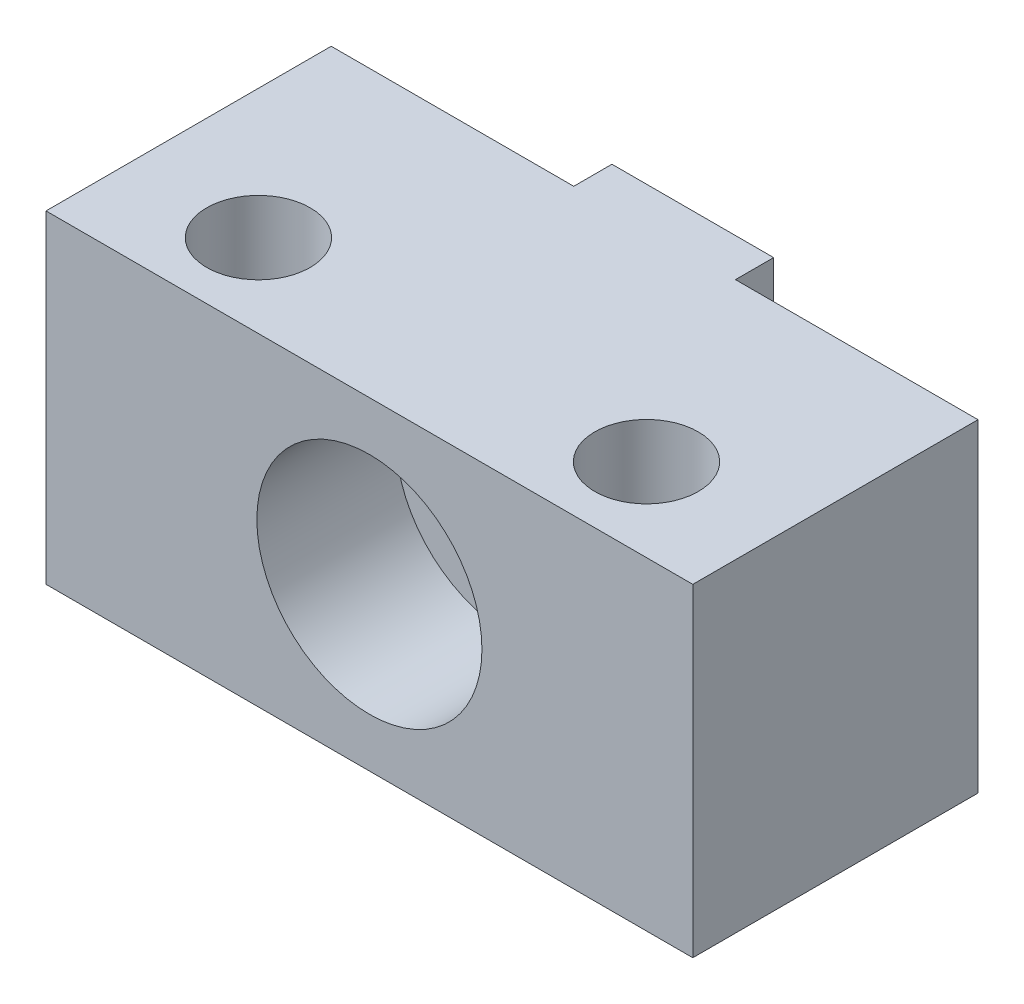
ISO-10303-21;
HEADER;
FILE_DESCRIPTION(('STEP AP214'),'2;1');
FILE_NAME('part.step','',(''),(''),'','','');
FILE_SCHEMA(('AUTOMOTIVE_DESIGN { 1 0 10303 214 1 1 1 1 }'));
ENDSEC;
DATA;
#1=APPLICATION_CONTEXT('core data for automotive mechanical design processes');
#2=APPLICATION_PROTOCOL_DEFINITION('international standard','automotive_design',2000,#1);
#3=PRODUCT_CONTEXT('',#1,'mechanical');
#4=PRODUCT('Part','Part','',(#3));
#5=PRODUCT_RELATED_PRODUCT_CATEGORY('part','',(#4));
#6=PRODUCT_DEFINITION_FORMATION('','',#4);
#7=PRODUCT_DEFINITION_CONTEXT('part definition',#1,'design');
#8=PRODUCT_DEFINITION('design','',#6,#7);
#9=PRODUCT_DEFINITION_SHAPE('','',#8);
#10=(LENGTH_UNIT() NAMED_UNIT(*) SI_UNIT(.MILLI.,.METRE.));
#11=(NAMED_UNIT(*) PLANE_ANGLE_UNIT() SI_UNIT($,.RADIAN.));
#12=(NAMED_UNIT(*) SI_UNIT($,.STERADIAN.) SOLID_ANGLE_UNIT());
#13=UNCERTAINTY_MEASURE_WITH_UNIT(LENGTH_MEASURE(1.E-05),#10,'distance_accuracy_value','');
#14=(GEOMETRIC_REPRESENTATION_CONTEXT(3) GLOBAL_UNCERTAINTY_ASSIGNED_CONTEXT((#13)) GLOBAL_UNIT_ASSIGNED_CONTEXT((#10,
#11,#12)) REPRESENTATION_CONTEXT('',''));
#15=CARTESIAN_POINT('',(0.,0.,0.));
#16=DIRECTION('',(0.,0.,1.));
#17=DIRECTION('',(1.,0.,0.));
#18=AXIS2_PLACEMENT_3D('',#15,#16,#17);
#19=CARTESIAN_POINT('',(-12.7,0.,11.2));
#20=DIRECTION('',(0.,0.,1.));
#21=DIRECTION('',(1.,0.,0.));
#22=AXIS2_PLACEMENT_3D('',#19,#20,#21);
#23=PLANE('',#22);
#24=CARTESIAN_POINT('',(0.,6.35,11.2));
#25=DIRECTION('',(0.,0.,1.));
#26=DIRECTION('',(1.,0.,0.));
#27=AXIS2_PLACEMENT_3D('',#24,#25,#26);
#28=CIRCLE('',#27,4.4196);
#29=CARTESIAN_POINT('',(4.4196,6.35,11.2));
#30=VERTEX_POINT('',#29);
#31=EDGE_CURVE('E184',#30,#30,#28,.T.);
#32=ORIENTED_EDGE('',*,*,#31,.F.);
#33=EDGE_LOOP('',(#32));
#34=FACE_BOUND('',#33,.T.);
#35=DIRECTION('',(1.,0.,0.));
#36=VECTOR('',#35,1.);
#37=CARTESIAN_POINT('',(-12.7,12.7,11.2));
#38=LINE('',#37,#36);
#39=CARTESIAN_POINT('',(-12.7,12.7,11.2));
#40=VERTEX_POINT('',#39);
#41=CARTESIAN_POINT('',(12.7,12.7,11.2));
#42=VERTEX_POINT('',#41);
#43=EDGE_CURVE('E128',#40,#42,#38,.T.);
#44=ORIENTED_EDGE('',*,*,#43,.F.);
#45=DIRECTION('',(0.,1.,0.));
#46=VECTOR('',#45,1.);
#47=CARTESIAN_POINT('',(-12.7,0.,11.2));
#48=LINE('',#47,#46);
#49=CARTESIAN_POINT('',(-12.7,0.,11.2));
#50=VERTEX_POINT('',#49);
#51=EDGE_CURVE('E11',#50,#40,#48,.T.);
#52=ORIENTED_EDGE('',*,*,#51,.F.);
#53=DIRECTION('',(1.,0.,0.));
#54=VECTOR('',#53,1.);
#55=CARTESIAN_POINT('',(-12.7,0.,11.2));
#56=LINE('',#55,#54);
#57=CARTESIAN_POINT('',(12.7,0.,11.2));
#58=VERTEX_POINT('',#57);
#59=EDGE_CURVE('E125',#50,#58,#56,.T.);
#60=ORIENTED_EDGE('',*,*,#59,.T.);
#61=DIRECTION('',(0.,1.,0.));
#62=VECTOR('',#61,1.);
#63=CARTESIAN_POINT('',(12.7,0.,11.2));
#64=LINE('',#63,#62);
#65=EDGE_CURVE('E40',#58,#42,#64,.T.);
#66=ORIENTED_EDGE('',*,*,#65,.T.);
#67=EDGE_LOOP('',(#44,#52,#60,#66));
#68=FACE_BOUND('',#67,.T.);
#69=ADVANCED_FACE('F37',(#34,#68),#23,.T.);
#70=CARTESIAN_POINT('',(-12.7,0.,-1.5));
#71=DIRECTION('',(-1.,0.,0.));
#72=DIRECTION('',(0.,0.,1.));
#73=AXIS2_PLACEMENT_3D('',#70,#71,#72);
#74=PLANE('',#73);
#75=DIRECTION('',(0.,-1.,0.));
#76=VECTOR('',#75,1.);
#77=CARTESIAN_POINT('',(-12.7,12.7,0.));
#78=LINE('',#77,#76);
#79=CARTESIAN_POINT('',(-12.7,12.7,0.));
#80=VERTEX_POINT('',#79);
#81=CARTESIAN_POINT('',(-12.7,0.,0.));
#82=VERTEX_POINT('',#81);
#83=EDGE_CURVE('E153',#80,#82,#78,.T.);
#84=ORIENTED_EDGE('',*,*,#83,.T.);
#85=DIRECTION('',(0.,0.,1.));
#86=VECTOR('',#85,1.);
#87=CARTESIAN_POINT('',(-12.7,0.,-1.5));
#88=LINE('',#87,#86);
#89=EDGE_CURVE('E134',#82,#50,#88,.T.);
#90=ORIENTED_EDGE('',*,*,#89,.T.);
#91=ORIENTED_EDGE('',*,*,#51,.T.);
#92=DIRECTION('',(0.,0.,1.));
#93=VECTOR('',#92,1.);
#94=CARTESIAN_POINT('',(-12.7,12.7,-1.5));
#95=LINE('',#94,#93);
#96=EDGE_CURVE('E122',#80,#40,#95,.T.);
#97=ORIENTED_EDGE('',*,*,#96,.F.);
#98=EDGE_LOOP('',(#84,#90,#91,#97));
#99=FACE_BOUND('',#98,.T.);
#100=ADVANCED_FACE('F192',(#99),#74,.T.);
#101=CARTESIAN_POINT('',(12.7,0.,-1.5));
#102=DIRECTION('',(0.,0.,-1.));
#103=DIRECTION('',(-1.,0.,0.));
#104=AXIS2_PLACEMENT_3D('',#101,#102,#103);
#105=PLANE('',#104);
#106=CARTESIAN_POINT('',(0.,6.35,-1.5));
#107=DIRECTION('',(0.,0.,1.));
#108=DIRECTION('',(1.,0.,0.));
#109=AXIS2_PLACEMENT_3D('',#106,#107,#108);
#110=CIRCLE('',#109,2.50000000000001);
#111=CARTESIAN_POINT('',(2.50000000000001,6.35,-1.5));
#112=VERTEX_POINT('',#111);
#113=EDGE_CURVE('E175',#112,#112,#110,.T.);
#114=ORIENTED_EDGE('',*,*,#113,.T.);
#115=EDGE_LOOP('',(#114));
#116=FACE_BOUND('',#115,.T.);
#117=DIRECTION('',(0.,-1.,0.));
#118=VECTOR('',#117,1.);
#119=CARTESIAN_POINT('',(-3.175,12.7,-1.5));
#120=LINE('',#119,#118);
#121=CARTESIAN_POINT('',(-3.175,12.7,-1.5));
#122=VERTEX_POINT('',#121);
#123=CARTESIAN_POINT('',(-3.175,0.,-1.5));
#124=VERTEX_POINT('',#123);
#125=EDGE_CURVE('E104',#122,#124,#120,.T.);
#126=ORIENTED_EDGE('',*,*,#125,.F.);
#127=DIRECTION('',(-1.,0.,0.));
#128=VECTOR('',#127,1.);
#129=CARTESIAN_POINT('',(12.7,12.7,-1.5));
#130=LINE('',#129,#128);
#131=CARTESIAN_POINT('',(3.175,12.7,-1.5));
#132=VERTEX_POINT('',#131);
#133=EDGE_CURVE('E116',#132,#122,#130,.T.);
#134=ORIENTED_EDGE('',*,*,#133,.F.);
#135=DIRECTION('',(0.,-1.,0.));
#136=VECTOR('',#135,1.);
#137=CARTESIAN_POINT('',(3.175,12.7,-1.5));
#138=LINE('',#137,#136);
#139=CARTESIAN_POINT('',(3.175,0.,-1.5));
#140=VERTEX_POINT('',#139);
#141=EDGE_CURVE('E133',#132,#140,#138,.T.);
#142=ORIENTED_EDGE('',*,*,#141,.T.);
#143=DIRECTION('',(-1.,0.,0.));
#144=VECTOR('',#143,1.);
#145=CARTESIAN_POINT('',(12.7,0.,-1.5));
#146=LINE('',#145,#144);
#147=EDGE_CURVE('E118',#140,#124,#146,.T.);
#148=ORIENTED_EDGE('',*,*,#147,.T.);
#149=EDGE_LOOP('',(#126,#134,#142,#148));
#150=FACE_BOUND('',#149,.T.);
#151=ADVANCED_FACE('F114',(#116,#150),#105,.T.);
#152=CARTESIAN_POINT('',(12.7,0.,11.2));
#153=DIRECTION('',(1.,0.,0.));
#154=DIRECTION('',(0.,0.,-1.));
#155=AXIS2_PLACEMENT_3D('',#152,#153,#154);
#156=PLANE('',#155);
#157=DIRECTION('',(0.,-1.,0.));
#158=VECTOR('',#157,1.);
#159=CARTESIAN_POINT('',(12.7,12.7,0.));
#160=LINE('',#159,#158);
#161=CARTESIAN_POINT('',(12.7,12.7,0.));
#162=VERTEX_POINT('',#161);
#163=CARTESIAN_POINT('',(12.7,0.,0.));
#164=VERTEX_POINT('',#163);
#165=EDGE_CURVE('E142',#162,#164,#160,.T.);
#166=ORIENTED_EDGE('',*,*,#165,.F.);
#167=DIRECTION('',(0.,0.,-1.));
#168=VECTOR('',#167,1.);
#169=CARTESIAN_POINT('',(12.7,12.7,11.2));
#170=LINE('',#169,#168);
#171=EDGE_CURVE('E123',#42,#162,#170,.T.);
#172=ORIENTED_EDGE('',*,*,#171,.F.);
#173=ORIENTED_EDGE('',*,*,#65,.F.);
#174=DIRECTION('',(0.,0.,-1.));
#175=VECTOR('',#174,1.);
#176=CARTESIAN_POINT('',(12.7,0.,11.2));
#177=LINE('',#176,#175);
#178=EDGE_CURVE('E137',#58,#164,#177,.T.);
#179=ORIENTED_EDGE('',*,*,#178,.T.);
#180=EDGE_LOOP('',(#166,#172,#173,#179));
#181=FACE_BOUND('',#180,.T.);
#182=ADVANCED_FACE('F208',(#181),#156,.T.);
#183=CARTESIAN_POINT('',(0.,0.,0.));
#184=DIRECTION('',(0.,1.,0.));
#185=DIRECTION('',(0.,0.,1.));
#186=AXIS2_PLACEMENT_3D('',#183,#184,#185);
#187=PLANE('',#186);
#188=CARTESIAN_POINT('',(-7.62,0.,7.9375));
#189=DIRECTION('',(0.,-1.,0.));
#190=DIRECTION('',(0.,0.,-1.));
#191=AXIS2_PLACEMENT_3D('',#188,#189,#190);
#192=CIRCLE('',#191,2.03199999999999);
#193=CARTESIAN_POINT('',(-7.62,0.,5.90550000000001));
#194=VERTEX_POINT('',#193);
#195=EDGE_CURVE('E172',#194,#194,#192,.T.);
#196=ORIENTED_EDGE('',*,*,#195,.F.);
#197=EDGE_LOOP('',(#196));
#198=FACE_BOUND('',#197,.T.);
#199=CARTESIAN_POINT('',(7.62,0.,7.9375));
#200=DIRECTION('',(0.,-1.,0.));
#201=DIRECTION('',(0.,0.,-1.));
#202=AXIS2_PLACEMENT_3D('',#199,#200,#201);
#203=CIRCLE('',#202,2.03199999999999);
#204=CARTESIAN_POINT('',(7.62,0.,5.90550000000001));
#205=VERTEX_POINT('',#204);
#206=EDGE_CURVE('E166',#205,#205,#203,.T.);
#207=ORIENTED_EDGE('',*,*,#206,.F.);
#208=EDGE_LOOP('',(#207));
#209=FACE_BOUND('',#208,.T.);
#210=ORIENTED_EDGE('',*,*,#89,.F.);
#211=DIRECTION('',(-1.,0.,0.));
#212=VECTOR('',#211,1.);
#213=CARTESIAN_POINT('',(-3.175,0.,0.));
#214=LINE('',#213,#212);
#215=CARTESIAN_POINT('',(-3.175,0.,0.));
#216=VERTEX_POINT('',#215);
#217=EDGE_CURVE('E109',#216,#82,#214,.T.);
#218=ORIENTED_EDGE('',*,*,#217,.F.);
#219=DIRECTION('',(0.,0.,1.));
#220=VECTOR('',#219,1.);
#221=CARTESIAN_POINT('',(-3.175,0.,-1.5));
#222=LINE('',#221,#220);
#223=EDGE_CURVE('E160',#124,#216,#222,.T.);
#224=ORIENTED_EDGE('',*,*,#223,.F.);
#225=ORIENTED_EDGE('',*,*,#147,.F.);
#226=DIRECTION('',(0.,0.,-1.));
#227=VECTOR('',#226,1.);
#228=CARTESIAN_POINT('',(3.175,0.,0.));
#229=LINE('',#228,#227);
#230=CARTESIAN_POINT('',(3.175,0.,0.));
#231=VERTEX_POINT('',#230);
#232=EDGE_CURVE('E147',#231,#140,#229,.T.);
#233=ORIENTED_EDGE('',*,*,#232,.F.);
#234=DIRECTION('',(-1.,0.,0.));
#235=VECTOR('',#234,1.);
#236=CARTESIAN_POINT('',(12.7,0.,0.));
#237=LINE('',#236,#235);
#238=EDGE_CURVE('E150',#164,#231,#237,.T.);
#239=ORIENTED_EDGE('',*,*,#238,.F.);
#240=ORIENTED_EDGE('',*,*,#178,.F.);
#241=ORIENTED_EDGE('',*,*,#59,.F.);
#242=EDGE_LOOP('',(#210,#218,#224,#225,#233,#239,#240,#241));
#243=FACE_BOUND('',#242,.T.);
#244=ADVANCED_FACE('F202',(#198,#209,#243),#187,.F.);
#245=CARTESIAN_POINT('',(0.,12.7,0.));
#246=DIRECTION('',(0.,1.,0.));
#247=DIRECTION('',(0.,0.,1.));
#248=AXIS2_PLACEMENT_3D('',#245,#246,#247);
#249=PLANE('',#248);
#250=CARTESIAN_POINT('',(-7.62,12.7,7.9375));
#251=DIRECTION('',(0.,-1.,0.));
#252=DIRECTION('',(0.,0.,-1.));
#253=AXIS2_PLACEMENT_3D('',#250,#251,#252);
#254=CIRCLE('',#253,2.03199999999999);
#255=CARTESIAN_POINT('',(-7.62,12.7,5.90550000000001));
#256=VERTEX_POINT('',#255);
#257=EDGE_CURVE('E169',#256,#256,#254,.T.);
#258=ORIENTED_EDGE('',*,*,#257,.T.);
#259=EDGE_LOOP('',(#258));
#260=FACE_BOUND('',#259,.T.);
#261=CARTESIAN_POINT('',(7.62,12.7,7.9375));
#262=DIRECTION('',(0.,-1.,0.));
#263=DIRECTION('',(0.,0.,-1.));
#264=AXIS2_PLACEMENT_3D('',#261,#262,#263);
#265=CIRCLE('',#264,2.03199999999999);
#266=CARTESIAN_POINT('',(7.62,12.7,5.90550000000001));
#267=VERTEX_POINT('',#266);
#268=EDGE_CURVE('E162',#267,#267,#265,.T.);
#269=ORIENTED_EDGE('',*,*,#268,.T.);
#270=EDGE_LOOP('',(#269));
#271=FACE_BOUND('',#270,.T.);
#272=DIRECTION('',(-1.,0.,0.));
#273=VECTOR('',#272,1.);
#274=CARTESIAN_POINT('',(-3.175,12.7,0.));
#275=LINE('',#274,#273);
#276=CARTESIAN_POINT('',(-3.175,12.7,0.));
#277=VERTEX_POINT('',#276);
#278=EDGE_CURVE('E51',#277,#80,#275,.T.);
#279=ORIENTED_EDGE('',*,*,#278,.T.);
#280=ORIENTED_EDGE('',*,*,#96,.T.);
#281=ORIENTED_EDGE('',*,*,#43,.T.);
#282=ORIENTED_EDGE('',*,*,#171,.T.);
#283=DIRECTION('',(-1.,0.,0.));
#284=VECTOR('',#283,1.);
#285=CARTESIAN_POINT('',(12.7,12.7,0.));
#286=LINE('',#285,#284);
#287=CARTESIAN_POINT('',(3.175,12.7,0.));
#288=VERTEX_POINT('',#287);
#289=EDGE_CURVE('E149',#162,#288,#286,.T.);
#290=ORIENTED_EDGE('',*,*,#289,.T.);
#291=DIRECTION('',(0.,0.,-1.));
#292=VECTOR('',#291,1.);
#293=CARTESIAN_POINT('',(3.175,12.7,0.));
#294=LINE('',#293,#292);
#295=EDGE_CURVE('E59',#288,#132,#294,.T.);
#296=ORIENTED_EDGE('',*,*,#295,.T.);
#297=ORIENTED_EDGE('',*,*,#133,.T.);
#298=DIRECTION('',(0.,0.,1.));
#299=VECTOR('',#298,1.);
#300=CARTESIAN_POINT('',(-3.175,12.7,-1.5));
#301=LINE('',#300,#299);
#302=EDGE_CURVE('E100',#122,#277,#301,.T.);
#303=ORIENTED_EDGE('',*,*,#302,.T.);
#304=EDGE_LOOP('',(#279,#280,#281,#282,#290,#296,#297,#303));
#305=FACE_BOUND('',#304,.T.);
#306=ADVANCED_FACE('F120',(#260,#271,#305),#249,.T.);
#307=CARTESIAN_POINT('',(3.175,12.7,0.));
#308=DIRECTION('',(-1.,0.,0.));
#309=DIRECTION('',(0.,0.,1.));
#310=AXIS2_PLACEMENT_3D('',#307,#308,#309);
#311=PLANE('',#310);
#312=ORIENTED_EDGE('',*,*,#232,.T.);
#313=ORIENTED_EDGE('',*,*,#141,.F.);
#314=ORIENTED_EDGE('',*,*,#295,.F.);
#315=DIRECTION('',(0.,-1.,0.));
#316=VECTOR('',#315,1.);
#317=CARTESIAN_POINT('',(3.175,12.7,0.));
#318=LINE('',#317,#316);
#319=EDGE_CURVE('E144',#288,#231,#318,.T.);
#320=ORIENTED_EDGE('',*,*,#319,.T.);
#321=EDGE_LOOP('',(#312,#313,#314,#320));
#322=FACE_BOUND('',#321,.T.);
#323=ADVANCED_FACE('F211',(#322),#311,.F.);
#324=CARTESIAN_POINT('',(12.7,12.7,0.));
#325=DIRECTION('',(0.,0.,1.));
#326=DIRECTION('',(1.,0.,0.));
#327=AXIS2_PLACEMENT_3D('',#324,#325,#326);
#328=PLANE('',#327);
#329=ORIENTED_EDGE('',*,*,#238,.T.);
#330=ORIENTED_EDGE('',*,*,#319,.F.);
#331=ORIENTED_EDGE('',*,*,#289,.F.);
#332=ORIENTED_EDGE('',*,*,#165,.T.);
#333=EDGE_LOOP('',(#329,#330,#331,#332));
#334=FACE_BOUND('',#333,.T.);
#335=ADVANCED_FACE('F210',(#334),#328,.F.);
#336=CARTESIAN_POINT('',(-3.175,12.7,0.));
#337=DIRECTION('',(0.,0.,1.));
#338=DIRECTION('',(1.,0.,0.));
#339=AXIS2_PLACEMENT_3D('',#336,#337,#338);
#340=PLANE('',#339);
#341=ORIENTED_EDGE('',*,*,#217,.T.);
#342=ORIENTED_EDGE('',*,*,#83,.F.);
#343=ORIENTED_EDGE('',*,*,#278,.F.);
#344=DIRECTION('',(0.,-1.,0.));
#345=VECTOR('',#344,1.);
#346=CARTESIAN_POINT('',(-3.175,12.7,0.));
#347=LINE('',#346,#345);
#348=EDGE_CURVE('E106',#277,#216,#347,.T.);
#349=ORIENTED_EDGE('',*,*,#348,.T.);
#350=EDGE_LOOP('',(#341,#342,#343,#349));
#351=FACE_BOUND('',#350,.T.);
#352=ADVANCED_FACE('F218',(#351),#340,.F.);
#353=CARTESIAN_POINT('',(-3.175,12.7,-1.5));
#354=DIRECTION('',(1.,0.,0.));
#355=DIRECTION('',(0.,0.,-1.));
#356=AXIS2_PLACEMENT_3D('',#353,#354,#355);
#357=PLANE('',#356);
#358=ORIENTED_EDGE('',*,*,#223,.T.);
#359=ORIENTED_EDGE('',*,*,#348,.F.);
#360=ORIENTED_EDGE('',*,*,#302,.F.);
#361=ORIENTED_EDGE('',*,*,#125,.T.);
#362=EDGE_LOOP('',(#358,#359,#360,#361));
#363=FACE_BOUND('',#362,.T.);
#364=ADVANCED_FACE('F103',(#363),#357,.F.);
#365=CARTESIAN_POINT('',(7.62,0.,7.9375));
#366=DIRECTION('',(0.,-1.,0.));
#367=DIRECTION('',(0.,0.,-1.));
#368=AXIS2_PLACEMENT_3D('',#365,#366,#367);
#369=CYLINDRICAL_SURFACE('',#368,2.03199999999999);
#370=ORIENTED_EDGE('',*,*,#268,.F.);
#371=EDGE_LOOP('',(#370));
#372=FACE_BOUND('',#371,.T.);
#373=ORIENTED_EDGE('',*,*,#206,.T.);
#374=EDGE_LOOP('',(#373));
#375=FACE_BOUND('',#374,.T.);
#376=ADVANCED_FACE('F252',(#372,#375),#369,.F.);
#377=CARTESIAN_POINT('',(-7.62,0.,7.9375));
#378=DIRECTION('',(0.,-1.,0.));
#379=DIRECTION('',(0.,0.,-1.));
#380=AXIS2_PLACEMENT_3D('',#377,#378,#379);
#381=CYLINDRICAL_SURFACE('',#380,2.03199999999999);
#382=ORIENTED_EDGE('',*,*,#257,.F.);
#383=EDGE_LOOP('',(#382));
#384=FACE_BOUND('',#383,.T.);
#385=ORIENTED_EDGE('',*,*,#195,.T.);
#386=EDGE_LOOP('',(#385));
#387=FACE_BOUND('',#386,.T.);
#388=ADVANCED_FACE('F257',(#384,#387),#381,.F.);
#389=CARTESIAN_POINT('',(0.,6.35,11.2));
#390=DIRECTION('',(0.,0.,1.));
#391=DIRECTION('',(1.,0.,0.));
#392=AXIS2_PLACEMENT_3D('',#389,#390,#391);
#393=CYLINDRICAL_SURFACE('',#392,2.50000000000001);
#394=ORIENTED_EDGE('',*,*,#113,.F.);
#395=EDGE_LOOP('',(#394));
#396=FACE_BOUND('',#395,.T.);
#397=CARTESIAN_POINT('',(0.,6.35,5.739));
#398=DIRECTION('',(0.,0.,1.));
#399=DIRECTION('',(1.,0.,0.));
#400=AXIS2_PLACEMENT_3D('',#397,#398,#399);
#401=CIRCLE('',#400,2.50000000000001);
#402=CARTESIAN_POINT('',(2.50000000000001,6.35,5.739));
#403=VERTEX_POINT('',#402);
#404=EDGE_CURVE('E178',#403,#403,#401,.T.);
#405=ORIENTED_EDGE('',*,*,#404,.T.);
#406=EDGE_LOOP('',(#405));
#407=FACE_BOUND('',#406,.T.);
#408=ADVANCED_FACE('F269',(#396,#407),#393,.F.);
#409=CARTESIAN_POINT('',(2.50000000000001,6.35,5.739));
#410=DIRECTION('',(0.,0.,-1.));
#411=DIRECTION('',(-1.,0.,0.));
#412=AXIS2_PLACEMENT_3D('',#409,#410,#411);
#413=PLANE('',#412);
#414=ORIENTED_EDGE('',*,*,#404,.F.);
#415=EDGE_LOOP('',(#414));
#416=FACE_BOUND('',#415,.T.);
#417=CARTESIAN_POINT('',(0.,6.35,5.739));
#418=DIRECTION('',(0.,0.,1.));
#419=DIRECTION('',(1.,0.,0.));
#420=AXIS2_PLACEMENT_3D('',#417,#418,#419);
#421=CIRCLE('',#420,4.4196);
#422=CARTESIAN_POINT('',(4.4196,6.35,5.739));
#423=VERTEX_POINT('',#422);
#424=EDGE_CURVE('E181',#423,#423,#421,.T.);
#425=ORIENTED_EDGE('',*,*,#424,.T.);
#426=EDGE_LOOP('',(#425));
#427=FACE_BOUND('',#426,.T.);
#428=ADVANCED_FACE('F290',(#416,#427),#413,.F.);
#429=CARTESIAN_POINT('',(0.,6.35,11.2));
#430=DIRECTION('',(0.,0.,1.));
#431=DIRECTION('',(1.,0.,0.));
#432=AXIS2_PLACEMENT_3D('',#429,#430,#431);
#433=CYLINDRICAL_SURFACE('',#432,4.4196);
#434=ORIENTED_EDGE('',*,*,#424,.F.);
#435=EDGE_LOOP('',(#434));
#436=FACE_BOUND('',#435,.T.);
#437=ORIENTED_EDGE('',*,*,#31,.T.);
#438=EDGE_LOOP('',(#437));
#439=FACE_BOUND('',#438,.T.);
#440=ADVANCED_FACE('F188',(#436,#439),#433,.F.);
#441=CLOSED_SHELL('',(#69,#100,#151,#182,#244,#306,#323,#335,#352,#364,#376,#388,#408,#428,#440));
#442=MANIFOLD_SOLID_BREP('B2',#441);
#443=ADVANCED_BREP_SHAPE_REPRESENTATION('',(#18,#442),#14);
#444=SHAPE_DEFINITION_REPRESENTATION(#9,#443);
ENDSEC;
END-ISO-10303-21;
